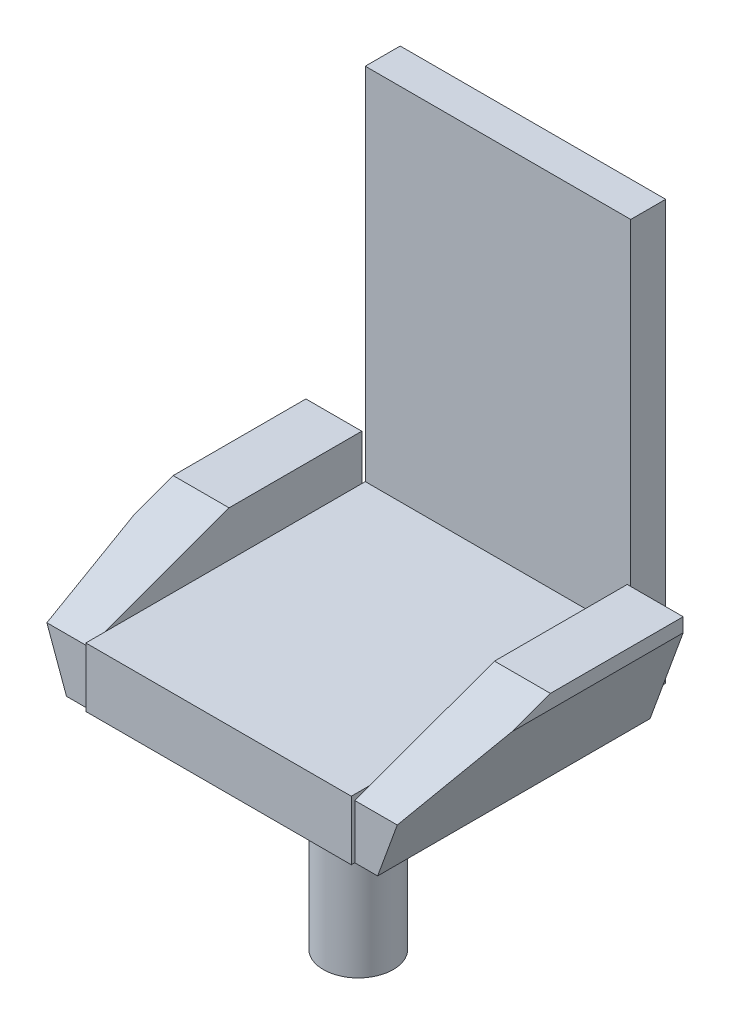
ISO-10303-21;
HEADER;
FILE_DESCRIPTION(('STEP AP214'),'2;1');
FILE_NAME('part.step','',(''),(''),'','','');
FILE_SCHEMA(('AUTOMOTIVE_DESIGN { 1 0 10303 214 1 1 1 1 }'));
ENDSEC;
DATA;
#1=APPLICATION_CONTEXT('core data for automotive mechanical design processes');
#2=APPLICATION_PROTOCOL_DEFINITION('international standard','automotive_design',2000,#1);
#3=PRODUCT_CONTEXT('',#1,'mechanical');
#4=PRODUCT('Part','Part','',(#3));
#5=PRODUCT_RELATED_PRODUCT_CATEGORY('part','',(#4));
#6=PRODUCT_DEFINITION_FORMATION('','',#4);
#7=PRODUCT_DEFINITION_CONTEXT('part definition',#1,'design');
#8=PRODUCT_DEFINITION('design','',#6,#7);
#9=PRODUCT_DEFINITION_SHAPE('','',#8);
#10=(LENGTH_UNIT() NAMED_UNIT(*) SI_UNIT(.MILLI.,.METRE.));
#11=(NAMED_UNIT(*) PLANE_ANGLE_UNIT() SI_UNIT($,.RADIAN.));
#12=(NAMED_UNIT(*) SI_UNIT($,.STERADIAN.) SOLID_ANGLE_UNIT());
#13=UNCERTAINTY_MEASURE_WITH_UNIT(LENGTH_MEASURE(1.E-05),#10,'distance_accuracy_value','');
#14=(GEOMETRIC_REPRESENTATION_CONTEXT(3) GLOBAL_UNCERTAINTY_ASSIGNED_CONTEXT((#13)) GLOBAL_UNIT_ASSIGNED_CONTEXT((#10,
#11,#12)) REPRESENTATION_CONTEXT('',''));
#15=CARTESIAN_POINT('',(0.,0.,0.));
#16=DIRECTION('',(0.,0.,1.));
#17=DIRECTION('',(1.,0.,0.));
#18=AXIS2_PLACEMENT_3D('',#15,#16,#17);
#19=CARTESIAN_POINT('',(190.,85.,200.));
#20=DIRECTION('',(-1.,0.,0.));
#21=DIRECTION('',(0.,0.,1.));
#22=AXIS2_PLACEMENT_3D('',#19,#20,#21);
#23=PLANE('',#22);
#24=DIRECTION('',(0.,-1.,0.));
#25=VECTOR('',#24,1.);
#26=CARTESIAN_POINT('',(190.,150.,195.));
#27=LINE('',#26,#25);
#28=CARTESIAN_POINT('',(190.,77.2059531467595,195.));
#29=VERTEX_POINT('',#28);
#30=CARTESIAN_POINT('',(190.,0.,195.));
#31=VERTEX_POINT('',#30);
#32=EDGE_CURVE('E228',#29,#31,#27,.T.);
#33=ORIENTED_EDGE('',*,*,#32,.F.);
#34=DIRECTION('',(0.,0.342020143325666,-0.93969262078591));
#35=VECTOR('',#34,1.);
#36=CARTESIAN_POINT('',(190.,76.5107144084965,196.910152734508));
#37=LINE('',#36,#35);
#38=CARTESIAN_POINT('',(190.,85.,173.58603226455));
#39=VERTEX_POINT('',#38);
#40=EDGE_CURVE('E300',#29,#39,#37,.T.);
#41=ORIENTED_EDGE('',*,*,#40,.T.);
#42=DIRECTION('',(0.,0.,-1.));
#43=VECTOR('',#42,1.);
#44=CARTESIAN_POINT('',(190.,85.,200.));
#45=LINE('',#44,#43);
#46=CARTESIAN_POINT('',(190.,85.,200.));
#47=VERTEX_POINT('',#46);
#48=EDGE_CURVE('E252',#47,#39,#45,.T.);
#49=ORIENTED_EDGE('',*,*,#48,.F.);
#50=DIRECTION('',(0.,-1.,0.));
#51=VECTOR('',#50,1.);
#52=CARTESIAN_POINT('',(190.,85.,200.));
#53=LINE('',#52,#51);
#54=CARTESIAN_POINT('',(190.,0.,200.));
#55=VERTEX_POINT('',#54);
#56=EDGE_CURVE('E266',#47,#55,#53,.T.);
#57=ORIENTED_EDGE('',*,*,#56,.T.);
#58=DIRECTION('',(0.,0.,-1.));
#59=VECTOR('',#58,1.);
#60=CARTESIAN_POINT('',(190.,0.,200.));
#61=LINE('',#60,#59);
#62=EDGE_CURVE('E267',#55,#31,#61,.T.);
#63=ORIENTED_EDGE('',*,*,#62,.T.);
#64=EDGE_LOOP('',(#33,#41,#49,#57,#63));
#65=FACE_BOUND('',#64,.T.);
#66=ADVANCED_FACE('F37',(#65),#23,.F.);
#67=CARTESIAN_POINT('',(-190.,85.,200.));
#68=DIRECTION('',(1.,0.,0.));
#69=DIRECTION('',(0.,0.,-1.));
#70=AXIS2_PLACEMENT_3D('',#67,#68,#69);
#71=PLANE('',#70);
#72=DIRECTION('',(0.,-1.,0.));
#73=VECTOR('',#72,1.);
#74=CARTESIAN_POINT('',(-190.,150.,-195.));
#75=LINE('',#74,#73);
#76=CARTESIAN_POINT('',(-190.,85.,-195.));
#77=VERTEX_POINT('',#76);
#78=CARTESIAN_POINT('',(-190.,0.,-195.));
#79=VERTEX_POINT('',#78);
#80=EDGE_CURVE('E247',#77,#79,#75,.T.);
#81=ORIENTED_EDGE('',*,*,#80,.F.);
#82=DIRECTION('',(0.,0.,1.));
#83=VECTOR('',#82,1.);
#84=CARTESIAN_POINT('',(-190.,85.,200.));
#85=LINE('',#84,#83);
#86=CARTESIAN_POINT('',(-190.,85.,-200.));
#87=VERTEX_POINT('',#86);
#88=EDGE_CURVE('E260',#87,#77,#85,.T.);
#89=ORIENTED_EDGE('',*,*,#88,.F.);
#90=DIRECTION('',(0.,1.,0.));
#91=VECTOR('',#90,1.);
#92=CARTESIAN_POINT('',(-190.,0.,-200.));
#93=LINE('',#92,#91);
#94=CARTESIAN_POINT('',(-190.,600.,-200.));
#95=VERTEX_POINT('',#94);
#96=EDGE_CURVE('E200',#87,#95,#93,.T.);
#97=ORIENTED_EDGE('',*,*,#96,.T.);
#98=DIRECTION('',(0.,0.,1.));
#99=VECTOR('',#98,1.);
#100=CARTESIAN_POINT('',(-190.,600.,-250.));
#101=LINE('',#100,#99);
#102=CARTESIAN_POINT('',(-190.,600.,-250.));
#103=VERTEX_POINT('',#102);
#104=EDGE_CURVE('E179',#103,#95,#101,.T.);
#105=ORIENTED_EDGE('',*,*,#104,.F.);
#106=DIRECTION('',(0.,1.,0.));
#107=VECTOR('',#106,1.);
#108=CARTESIAN_POINT('',(-190.,0.,-250.));
#109=LINE('',#108,#107);
#110=CARTESIAN_POINT('',(-190.,0.,-250.));
#111=VERTEX_POINT('',#110);
#112=EDGE_CURVE('E186',#111,#103,#109,.T.);
#113=ORIENTED_EDGE('',*,*,#112,.F.);
#114=DIRECTION('',(0.,0.,1.));
#115=VECTOR('',#114,1.);
#116=CARTESIAN_POINT('',(-190.,0.,200.));
#117=LINE('',#116,#115);
#118=EDGE_CURVE('E271',#111,#79,#117,.T.);
#119=ORIENTED_EDGE('',*,*,#118,.T.);
#120=EDGE_LOOP('',(#81,#89,#97,#105,#113,#119));
#121=FACE_BOUND('',#120,.T.);
#122=ADVANCED_FACE('F198',(#121),#71,.F.);
#123=CARTESIAN_POINT('',(190.,85.,-195.));
#124=VERTEX_POINT('',#123);
#125=CARTESIAN_POINT('',(190.,85.,-200.));
#126=VERTEX_POINT('',#125);
#127=EDGE_CURVE('E256',#124,#126,#45,.T.);
#128=ORIENTED_EDGE('',*,*,#127,.F.);
#129=DIRECTION('',(0.,-1.,0.));
#130=VECTOR('',#129,1.);
#131=CARTESIAN_POINT('',(190.,150.,-195.));
#132=LINE('',#131,#130);
#133=CARTESIAN_POINT('',(190.,0.,-195.));
#134=VERTEX_POINT('',#133);
#135=EDGE_CURVE('E224',#124,#134,#132,.T.);
#136=ORIENTED_EDGE('',*,*,#135,.T.);
#137=CARTESIAN_POINT('',(190.,0.,-250.));
#138=VERTEX_POINT('',#137);
#139=EDGE_CURVE('E246',#134,#138,#61,.T.);
#140=ORIENTED_EDGE('',*,*,#139,.T.);
#141=DIRECTION('',(0.,-1.,0.));
#142=VECTOR('',#141,1.);
#143=CARTESIAN_POINT('',(190.,0.,-250.));
#144=LINE('',#143,#142);
#145=CARTESIAN_POINT('',(190.,600.,-250.));
#146=VERTEX_POINT('',#145);
#147=EDGE_CURVE('E185',#146,#138,#144,.T.);
#148=ORIENTED_EDGE('',*,*,#147,.F.);
#149=DIRECTION('',(0.,0.,1.));
#150=VECTOR('',#149,1.);
#151=CARTESIAN_POINT('',(190.,600.,-250.));
#152=LINE('',#151,#150);
#153=CARTESIAN_POINT('',(190.,600.,-200.));
#154=VERTEX_POINT('',#153);
#155=EDGE_CURVE('E181',#146,#154,#152,.T.);
#156=ORIENTED_EDGE('',*,*,#155,.T.);
#157=DIRECTION('',(0.,-1.,0.));
#158=VECTOR('',#157,1.);
#159=CARTESIAN_POINT('',(190.,0.,-200.));
#160=LINE('',#159,#158);
#161=EDGE_CURVE('E195',#154,#126,#160,.T.);
#162=ORIENTED_EDGE('',*,*,#161,.T.);
#163=EDGE_LOOP('',(#128,#136,#140,#148,#156,#162));
#164=FACE_BOUND('',#163,.T.);
#165=ADVANCED_FACE('F366',(#164),#23,.F.);
#166=CARTESIAN_POINT('',(-190.,85.,173.58603226455));
#167=VERTEX_POINT('',#166);
#168=CARTESIAN_POINT('',(-190.,85.,200.));
#169=VERTEX_POINT('',#168);
#170=EDGE_CURVE('E259',#167,#169,#85,.T.);
#171=ORIENTED_EDGE('',*,*,#170,.F.);
#172=DIRECTION('',(0.,-0.342020143325666,0.93969262078591));
#173=VECTOR('',#172,1.);
#174=CARTESIAN_POINT('',(-190.,76.5107144084965,196.910152734508));
#175=LINE('',#174,#173);
#176=CARTESIAN_POINT('',(-190.,77.2059531467595,195.));
#177=VERTEX_POINT('',#176);
#178=EDGE_CURVE('E298',#167,#177,#175,.T.);
#179=ORIENTED_EDGE('',*,*,#178,.T.);
#180=DIRECTION('',(0.,-1.,0.));
#181=VECTOR('',#180,1.);
#182=CARTESIAN_POINT('',(-190.,150.,195.));
#183=LINE('',#182,#181);
#184=CARTESIAN_POINT('',(-190.,0.,195.));
#185=VERTEX_POINT('',#184);
#186=EDGE_CURVE('E248',#177,#185,#183,.T.);
#187=ORIENTED_EDGE('',*,*,#186,.T.);
#188=CARTESIAN_POINT('',(-190.,0.,200.));
#189=VERTEX_POINT('',#188);
#190=EDGE_CURVE('E270',#185,#189,#117,.T.);
#191=ORIENTED_EDGE('',*,*,#190,.T.);
#192=DIRECTION('',(0.,-1.,0.));
#193=VECTOR('',#192,1.);
#194=CARTESIAN_POINT('',(-190.,85.,200.));
#195=LINE('',#194,#193);
#196=EDGE_CURVE('E251',#169,#189,#195,.T.);
#197=ORIENTED_EDGE('',*,*,#196,.F.);
#198=EDGE_LOOP('',(#171,#179,#187,#191,#197));
#199=FACE_BOUND('',#198,.T.);
#200=ADVANCED_FACE('F341',(#199),#71,.F.);
#201=CARTESIAN_POINT('',(-190.,85.,200.));
#202=DIRECTION('',(0.,0.,-1.));
#203=DIRECTION('',(-1.,0.,0.));
#204=AXIS2_PLACEMENT_3D('',#201,#202,#203);
#205=PLANE('',#204);
#206=DIRECTION('',(1.,0.,0.));
#207=VECTOR('',#206,1.);
#208=CARTESIAN_POINT('',(-190.,0.,200.));
#209=LINE('',#208,#207);
#210=EDGE_CURVE('E273',#189,#55,#209,.T.);
#211=ORIENTED_EDGE('',*,*,#210,.T.);
#212=ORIENTED_EDGE('',*,*,#56,.F.);
#213=DIRECTION('',(1.,0.,0.));
#214=VECTOR('',#213,1.);
#215=CARTESIAN_POINT('',(-190.,85.,200.));
#216=LINE('',#215,#214);
#217=EDGE_CURVE('E263',#169,#47,#216,.T.);
#218=ORIENTED_EDGE('',*,*,#217,.F.);
#219=ORIENTED_EDGE('',*,*,#196,.T.);
#220=EDGE_LOOP('',(#211,#212,#218,#219));
#221=FACE_BOUND('',#220,.T.);
#222=ADVANCED_FACE('F344',(#221),#205,.F.);
#223=CARTESIAN_POINT('',(0.,85.,0.));
#224=DIRECTION('',(0.,-1.,0.));
#225=DIRECTION('',(0.,0.,-1.));
#226=AXIS2_PLACEMENT_3D('',#223,#224,#225);
#227=PLANE('',#226);
#228=ORIENTED_EDGE('',*,*,#48,.T.);
#229=EDGE_CURVE('E255',#39,#124,#45,.T.);
#230=ORIENTED_EDGE('',*,*,#229,.T.);
#231=ORIENTED_EDGE('',*,*,#127,.T.);
#232=DIRECTION('',(-1.,0.,0.));
#233=VECTOR('',#232,1.);
#234=CARTESIAN_POINT('',(-190.,85.,-200.));
#235=LINE('',#234,#233);
#236=EDGE_CURVE('E254',#126,#87,#235,.T.);
#237=ORIENTED_EDGE('',*,*,#236,.T.);
#238=ORIENTED_EDGE('',*,*,#88,.T.);
#239=EDGE_CURVE('E264',#77,#167,#85,.T.);
#240=ORIENTED_EDGE('',*,*,#239,.T.);
#241=ORIENTED_EDGE('',*,*,#170,.T.);
#242=ORIENTED_EDGE('',*,*,#217,.T.);
#243=EDGE_LOOP('',(#228,#230,#231,#237,#238,#240,#241,#242));
#244=FACE_BOUND('',#243,.T.);
#245=ADVANCED_FACE('F348',(#244),#227,.F.);
#246=CARTESIAN_POINT('',(0.,0.,0.));
#247=DIRECTION('',(0.,-1.,0.));
#248=DIRECTION('',(0.,0.,-1.));
#249=AXIS2_PLACEMENT_3D('',#246,#247,#248);
#250=PLANE('',#249);
#251=CARTESIAN_POINT('',(0.,0.,0.));
#252=DIRECTION('',(0.,-1.,0.));
#253=DIRECTION('',(0.,0.,-1.));
#254=AXIS2_PLACEMENT_3D('',#251,#252,#253);
#255=CIRCLE('',#254,50.);
#256=CARTESIAN_POINT('',(0.,0.,-50.));
#257=VERTEX_POINT('',#256);
#258=EDGE_CURVE('E375',#257,#257,#255,.T.);
#259=ORIENTED_EDGE('',*,*,#258,.F.);
#260=EDGE_LOOP('',(#259));
#261=FACE_BOUND('',#260,.T.);
#262=DIRECTION('',(1.,0.,0.));
#263=VECTOR('',#262,1.);
#264=CARTESIAN_POINT('',(0.,0.,-195.));
#265=LINE('',#264,#263);
#266=CARTESIAN_POINT('',(222.683869545394,0.,-195.));
#267=VERTEX_POINT('',#266);
#268=EDGE_CURVE('E205',#134,#267,#265,.T.);
#269=ORIENTED_EDGE('',*,*,#268,.T.);
#270=DIRECTION('',(0.,0.,1.));
#271=VECTOR('',#270,1.);
#272=CARTESIAN_POINT('',(222.683869545394,0.,195.));
#273=LINE('',#272,#271);
#274=CARTESIAN_POINT('',(222.683869545394,0.,195.));
#275=VERTEX_POINT('',#274);
#276=EDGE_CURVE('E311',#267,#275,#273,.T.);
#277=ORIENTED_EDGE('',*,*,#276,.T.);
#278=DIRECTION('',(1.,0.,0.));
#279=VECTOR('',#278,1.);
#280=CARTESIAN_POINT('',(0.,0.,195.));
#281=LINE('',#280,#279);
#282=EDGE_CURVE('E202',#31,#275,#281,.T.);
#283=ORIENTED_EDGE('',*,*,#282,.F.);
#284=ORIENTED_EDGE('',*,*,#62,.F.);
#285=ORIENTED_EDGE('',*,*,#210,.F.);
#286=ORIENTED_EDGE('',*,*,#190,.F.);
#287=DIRECTION('',(1.,0.,0.));
#288=VECTOR('',#287,1.);
#289=CARTESIAN_POINT('',(0.,0.,195.));
#290=LINE('',#289,#288);
#291=CARTESIAN_POINT('',(-222.683869545394,0.,195.));
#292=VERTEX_POINT('',#291);
#293=EDGE_CURVE('E227',#292,#185,#290,.T.);
#294=ORIENTED_EDGE('',*,*,#293,.F.);
#295=DIRECTION('',(0.,0.,-1.));
#296=VECTOR('',#295,1.);
#297=CARTESIAN_POINT('',(-222.683869545394,0.,0.));
#298=LINE('',#297,#296);
#299=CARTESIAN_POINT('',(-222.683869545394,0.,-195.));
#300=VERTEX_POINT('',#299);
#301=EDGE_CURVE('E308',#292,#300,#298,.T.);
#302=ORIENTED_EDGE('',*,*,#301,.T.);
#303=DIRECTION('',(1.,0.,0.));
#304=VECTOR('',#303,1.);
#305=CARTESIAN_POINT('',(0.,0.,-195.));
#306=LINE('',#305,#304);
#307=EDGE_CURVE('E234',#300,#79,#306,.T.);
#308=ORIENTED_EDGE('',*,*,#307,.T.);
#309=ORIENTED_EDGE('',*,*,#118,.F.);
#310=DIRECTION('',(-1.,0.,0.));
#311=VECTOR('',#310,1.);
#312=CARTESIAN_POINT('',(-190.,0.,-250.));
#313=LINE('',#312,#311);
#314=EDGE_CURVE('E192',#138,#111,#313,.T.);
#315=ORIENTED_EDGE('',*,*,#314,.F.);
#316=ORIENTED_EDGE('',*,*,#139,.F.);
#317=EDGE_LOOP('',(#269,#277,#283,#284,#285,#286,#294,#302,#308,#309,#315,#316));
#318=FACE_BOUND('',#317,.T.);
#319=ADVANCED_FACE('F336',(#261,#318),#250,.T.);
#320=CARTESIAN_POINT('',(0.,150.,195.));
#321=DIRECTION('',(0.,0.,-1.));
#322=DIRECTION('',(-1.,0.,0.));
#323=AXIS2_PLACEMENT_3D('',#320,#321,#322);
#324=PLANE('',#323);
#325=DIRECTION('',(-1.,0.,0.));
#326=VECTOR('',#325,1.);
#327=CARTESIAN_POINT('',(-270.,77.2059531467595,195.));
#328=LINE('',#327,#326);
#329=CARTESIAN_POINT('',(-250.784538398965,77.2059531467595,195.));
#330=VERTEX_POINT('',#329);
#331=EDGE_CURVE('E284',#177,#330,#328,.T.);
#332=ORIENTED_EDGE('',*,*,#331,.T.);
#333=DIRECTION('',(-0.342020143325666,0.939692620785909,0.));
#334=VECTOR('',#333,1.);
#335=CARTESIAN_POINT('',(-222.683869545394,0.,195.));
#336=LINE('',#335,#334);
#337=EDGE_CURVE('E11',#330,#292,#336,.F.);
#338=ORIENTED_EDGE('',*,*,#337,.T.);
#339=ORIENTED_EDGE('',*,*,#293,.T.);
#340=ORIENTED_EDGE('',*,*,#186,.F.);
#341=EDGE_LOOP('',(#332,#338,#339,#340));
#342=FACE_BOUND('',#341,.T.);
#343=ADVANCED_FACE('F332',(#342),#324,.F.);
#344=CARTESIAN_POINT('',(-190.,150.,0.));
#345=DIRECTION('',(-1.,0.,0.));
#346=DIRECTION('',(0.,0.,1.));
#347=AXIS2_PLACEMENT_3D('',#344,#345,#346);
#348=PLANE('',#347);
#349=DIRECTION('',(0.,0.,-1.));
#350=VECTOR('',#349,1.);
#351=CARTESIAN_POINT('',(-190.,150.,0.));
#352=LINE('',#351,#350);
#353=CARTESIAN_POINT('',(-190.,150.,-5.00000000000195));
#354=VERTEX_POINT('',#353);
#355=CARTESIAN_POINT('',(-190.,150.,-195.));
#356=VERTEX_POINT('',#355);
#357=EDGE_CURVE('E231',#354,#356,#352,.T.);
#358=ORIENTED_EDGE('',*,*,#357,.F.);
#359=DIRECTION('',(0.,-0.342020143325666,0.93969262078591));
#360=VECTOR('',#359,1.);
#361=CARTESIAN_POINT('',(-190.,150.,-5.00000000000195));
#362=LINE('',#361,#360);
#363=EDGE_CURVE('E281',#354,#167,#362,.T.);
#364=ORIENTED_EDGE('',*,*,#363,.T.);
#365=ORIENTED_EDGE('',*,*,#239,.F.);
#366=EDGE_CURVE('E243',#356,#77,#75,.T.);
#367=ORIENTED_EDGE('',*,*,#366,.F.);
#368=EDGE_LOOP('',(#358,#364,#365,#367));
#369=FACE_BOUND('',#368,.T.);
#370=ADVANCED_FACE('F353',(#369),#348,.F.);
#371=CARTESIAN_POINT('',(0.,150.,-195.));
#372=DIRECTION('',(0.,0.,-1.));
#373=DIRECTION('',(-1.,0.,0.));
#374=AXIS2_PLACEMENT_3D('',#371,#372,#373);
#375=PLANE('',#374);
#376=ORIENTED_EDGE('',*,*,#307,.F.);
#377=DIRECTION('',(0.342020143325666,-0.939692620785909,0.));
#378=VECTOR('',#377,1.);
#379=CARTESIAN_POINT('',(-244.843875917927,60.8841171235077,-195.));
#380=LINE('',#379,#378);
#381=CARTESIAN_POINT('',(-270.,130.000000000001,-195.));
#382=VERTEX_POINT('',#381);
#383=EDGE_CURVE('E317',#300,#382,#380,.F.);
#384=ORIENTED_EDGE('',*,*,#383,.T.);
#385=DIRECTION('',(0.,-1.,0.));
#386=VECTOR('',#385,1.);
#387=CARTESIAN_POINT('',(-270.,150.,-195.));
#388=LINE('',#387,#386);
#389=CARTESIAN_POINT('',(-270.,150.,-195.));
#390=VERTEX_POINT('',#389);
#391=EDGE_CURVE('E239',#390,#382,#388,.T.);
#392=ORIENTED_EDGE('',*,*,#391,.F.);
#393=DIRECTION('',(1.,0.,0.));
#394=VECTOR('',#393,1.);
#395=CARTESIAN_POINT('',(0.,150.,-195.));
#396=LINE('',#395,#394);
#397=EDGE_CURVE('E233',#390,#356,#396,.T.);
#398=ORIENTED_EDGE('',*,*,#397,.T.);
#399=ORIENTED_EDGE('',*,*,#366,.T.);
#400=ORIENTED_EDGE('',*,*,#80,.T.);
#401=EDGE_LOOP('',(#376,#384,#392,#398,#399,#400));
#402=FACE_BOUND('',#401,.T.);
#403=ADVANCED_FACE('F322',(#402),#375,.T.);
#404=CARTESIAN_POINT('',(-270.,150.,0.));
#405=DIRECTION('',(-1.,0.,0.));
#406=DIRECTION('',(0.,0.,1.));
#407=AXIS2_PLACEMENT_3D('',#404,#405,#406);
#408=PLANE('',#407);
#409=ORIENTED_EDGE('',*,*,#391,.T.);
#410=DIRECTION('',(0.,0.,1.));
#411=VECTOR('',#410,1.);
#412=CARTESIAN_POINT('',(-270.,130.000000000001,0.));
#413=LINE('',#412,#411);
#414=CARTESIAN_POINT('',(-270.,130.000000000001,49.9495483890879));
#415=VERTEX_POINT('',#414);
#416=EDGE_CURVE('E60',#382,#415,#413,.T.);
#417=ORIENTED_EDGE('',*,*,#416,.T.);
#418=DIRECTION('',(0.,0.342020143325666,-0.93969262078591));
#419=VECTOR('',#418,1.);
#420=CARTESIAN_POINT('',(-270.,148.393030975783,-0.584888892202773));
#421=LINE('',#420,#419);
#422=CARTESIAN_POINT('',(-270.,150.,-5.00000000000195));
#423=VERTEX_POINT('',#422);
#424=EDGE_CURVE('E286',#415,#423,#421,.T.);
#425=ORIENTED_EDGE('',*,*,#424,.T.);
#426=DIRECTION('',(0.,0.,-1.));
#427=VECTOR('',#426,1.);
#428=CARTESIAN_POINT('',(-270.,150.,0.));
#429=LINE('',#428,#427);
#430=EDGE_CURVE('E237',#423,#390,#429,.T.);
#431=ORIENTED_EDGE('',*,*,#430,.T.);
#432=EDGE_LOOP('',(#409,#417,#425,#431));
#433=FACE_BOUND('',#432,.T.);
#434=ADVANCED_FACE('F327',(#433),#408,.T.);
#435=CARTESIAN_POINT('',(0.,150.,0.));
#436=DIRECTION('',(0.,1.,0.));
#437=DIRECTION('',(0.,0.,1.));
#438=AXIS2_PLACEMENT_3D('',#435,#436,#437);
#439=PLANE('',#438);
#440=ORIENTED_EDGE('',*,*,#430,.F.);
#441=DIRECTION('',(1.,0.,0.));
#442=VECTOR('',#441,1.);
#443=CARTESIAN_POINT('',(-190.,150.,-5.00000000000195));
#444=LINE('',#443,#442);
#445=EDGE_CURVE('E230',#423,#354,#444,.T.);
#446=ORIENTED_EDGE('',*,*,#445,.T.);
#447=ORIENTED_EDGE('',*,*,#357,.T.);
#448=ORIENTED_EDGE('',*,*,#397,.F.);
#449=EDGE_LOOP('',(#440,#446,#447,#448));
#450=FACE_BOUND('',#449,.T.);
#451=ADVANCED_FACE('F358',(#450),#439,.T.);
#452=CARTESIAN_POINT('',(190.,150.,0.));
#453=DIRECTION('',(1.,0.,0.));
#454=DIRECTION('',(0.,0.,-1.));
#455=AXIS2_PLACEMENT_3D('',#452,#453,#454);
#456=PLANE('',#455);
#457=ORIENTED_EDGE('',*,*,#229,.F.);
#458=DIRECTION('',(0.,0.342020143325666,-0.93969262078591));
#459=VECTOR('',#458,1.);
#460=CARTESIAN_POINT('',(190.,150.,-5.00000000000195));
#461=LINE('',#460,#459);
#462=CARTESIAN_POINT('',(190.,150.,-5.00000000000195));
#463=VERTEX_POINT('',#462);
#464=EDGE_CURVE('E296',#39,#463,#461,.T.);
#465=ORIENTED_EDGE('',*,*,#464,.T.);
#466=DIRECTION('',(0.,0.,1.));
#467=VECTOR('',#466,1.);
#468=CARTESIAN_POINT('',(190.,150.,0.));
#469=LINE('',#468,#467);
#470=CARTESIAN_POINT('',(190.,150.,-195.));
#471=VERTEX_POINT('',#470);
#472=EDGE_CURVE('E210',#471,#463,#469,.T.);
#473=ORIENTED_EDGE('',*,*,#472,.F.);
#474=EDGE_CURVE('E217',#471,#124,#132,.T.);
#475=ORIENTED_EDGE('',*,*,#474,.T.);
#476=EDGE_LOOP('',(#457,#465,#473,#475));
#477=FACE_BOUND('',#476,.T.);
#478=ADVANCED_FACE('F465',(#477),#456,.F.);
#479=CARTESIAN_POINT('',(0.,150.,195.));
#480=DIRECTION('',(0.,0.,-1.));
#481=DIRECTION('',(-1.,0.,0.));
#482=AXIS2_PLACEMENT_3D('',#479,#480,#481);
#483=PLANE('',#482);
#484=ORIENTED_EDGE('',*,*,#282,.T.);
#485=DIRECTION('',(0.342020143325666,0.939692620785909,0.));
#486=VECTOR('',#485,1.);
#487=CARTESIAN_POINT('',(270.,130.000000000001,195.));
#488=LINE('',#487,#486);
#489=CARTESIAN_POINT('',(250.784538398965,77.2059531467595,195.));
#490=VERTEX_POINT('',#489);
#491=EDGE_CURVE('E313',#275,#490,#488,.T.);
#492=ORIENTED_EDGE('',*,*,#491,.T.);
#493=DIRECTION('',(-1.,0.,0.));
#494=VECTOR('',#493,1.);
#495=CARTESIAN_POINT('',(190.,77.2059531467595,195.));
#496=LINE('',#495,#494);
#497=EDGE_CURVE('E294',#490,#29,#496,.T.);
#498=ORIENTED_EDGE('',*,*,#497,.T.);
#499=ORIENTED_EDGE('',*,*,#32,.T.);
#500=EDGE_LOOP('',(#484,#492,#498,#499));
#501=FACE_BOUND('',#500,.T.);
#502=ADVANCED_FACE('F471',(#501),#483,.F.);
#503=CARTESIAN_POINT('',(270.,150.,0.));
#504=DIRECTION('',(-1.,0.,0.));
#505=DIRECTION('',(0.,0.,1.));
#506=AXIS2_PLACEMENT_3D('',#503,#504,#505);
#507=PLANE('',#506);
#508=DIRECTION('',(0.,-0.342020143325666,0.93969262078591));
#509=VECTOR('',#508,1.);
#510=CARTESIAN_POINT('',(270.,150.,-5.00000000000195));
#511=LINE('',#510,#509);
#512=CARTESIAN_POINT('',(270.,150.,-5.00000000000195));
#513=VERTEX_POINT('',#512);
#514=CARTESIAN_POINT('',(270.,130.000000000001,49.9495483890879));
#515=VERTEX_POINT('',#514);
#516=EDGE_CURVE('E291',#513,#515,#511,.T.);
#517=ORIENTED_EDGE('',*,*,#516,.T.);
#518=DIRECTION('',(0.,0.,-1.));
#519=VECTOR('',#518,1.);
#520=CARTESIAN_POINT('',(270.,130.000000000001,-195.));
#521=LINE('',#520,#519);
#522=CARTESIAN_POINT('',(270.,130.000000000001,-195.));
#523=VERTEX_POINT('',#522);
#524=EDGE_CURVE('E303',#515,#523,#521,.T.);
#525=ORIENTED_EDGE('',*,*,#524,.T.);
#526=DIRECTION('',(0.,-1.,0.));
#527=VECTOR('',#526,1.);
#528=CARTESIAN_POINT('',(270.,150.,-195.));
#529=LINE('',#528,#527);
#530=CARTESIAN_POINT('',(270.,150.,-195.));
#531=VERTEX_POINT('',#530);
#532=EDGE_CURVE('E223',#531,#523,#529,.T.);
#533=ORIENTED_EDGE('',*,*,#532,.F.);
#534=DIRECTION('',(0.,0.,-1.));
#535=VECTOR('',#534,1.);
#536=CARTESIAN_POINT('',(270.,150.,0.));
#537=LINE('',#536,#535);
#538=EDGE_CURVE('E213',#513,#531,#537,.T.);
#539=ORIENTED_EDGE('',*,*,#538,.F.);
#540=EDGE_LOOP('',(#517,#525,#533,#539));
#541=FACE_BOUND('',#540,.T.);
#542=ADVANCED_FACE('F479',(#541),#507,.F.);
#543=CARTESIAN_POINT('',(0.,150.,-195.));
#544=DIRECTION('',(0.,0.,-1.));
#545=DIRECTION('',(-1.,0.,0.));
#546=AXIS2_PLACEMENT_3D('',#543,#544,#545);
#547=PLANE('',#546);
#548=ORIENTED_EDGE('',*,*,#532,.T.);
#549=DIRECTION('',(-0.342020143325666,-0.939692620785909,0.));
#550=VECTOR('',#549,1.);
#551=CARTESIAN_POINT('',(244.843875917928,60.8841171235077,-195.));
#552=LINE('',#551,#550);
#553=EDGE_CURVE('E306',#523,#267,#552,.T.);
#554=ORIENTED_EDGE('',*,*,#553,.T.);
#555=ORIENTED_EDGE('',*,*,#268,.F.);
#556=ORIENTED_EDGE('',*,*,#135,.F.);
#557=ORIENTED_EDGE('',*,*,#474,.F.);
#558=DIRECTION('',(1.,0.,0.));
#559=VECTOR('',#558,1.);
#560=CARTESIAN_POINT('',(0.,150.,-195.));
#561=LINE('',#560,#559);
#562=EDGE_CURVE('E215',#471,#531,#561,.T.);
#563=ORIENTED_EDGE('',*,*,#562,.T.);
#564=EDGE_LOOP('',(#548,#554,#555,#556,#557,#563));
#565=FACE_BOUND('',#564,.T.);
#566=ADVANCED_FACE('F491',(#565),#547,.T.);
#567=CARTESIAN_POINT('',(0.,150.,0.));
#568=DIRECTION('',(0.,1.,0.));
#569=DIRECTION('',(0.,0.,1.));
#570=AXIS2_PLACEMENT_3D('',#567,#568,#569);
#571=PLANE('',#570);
#572=ORIENTED_EDGE('',*,*,#472,.T.);
#573=DIRECTION('',(1.,0.,0.));
#574=VECTOR('',#573,1.);
#575=CARTESIAN_POINT('',(270.,150.,-5.00000000000195));
#576=LINE('',#575,#574);
#577=EDGE_CURVE('E288',#463,#513,#576,.T.);
#578=ORIENTED_EDGE('',*,*,#577,.T.);
#579=ORIENTED_EDGE('',*,*,#538,.T.);
#580=ORIENTED_EDGE('',*,*,#562,.F.);
#581=EDGE_LOOP('',(#572,#578,#579,#580));
#582=FACE_BOUND('',#581,.T.);
#583=ADVANCED_FACE('F502',(#582),#571,.T.);
#584=CARTESIAN_POINT('',(0.,150.,-5.00000000000195));
#585=DIRECTION('',(0.,0.93969262078591,0.342020143325666));
#586=DIRECTION('',(-1.,0.,0.));
#587=AXIS2_PLACEMENT_3D('',#584,#585,#586);
#588=PLANE('',#587);
#589=ORIENTED_EDGE('',*,*,#424,.F.);
#590=DIRECTION('',(-0.123531673829373,0.339400484433638,-0.932495167133388));
#591=VECTOR('',#590,1.);
#592=CARTESIAN_POINT('',(-273.0481003294,138.37458682726,26.9405601839325));
#593=LINE('',#592,#591);
#594=EDGE_CURVE('E46',#415,#330,#593,.F.);
#595=ORIENTED_EDGE('',*,*,#594,.T.);
#596=ORIENTED_EDGE('',*,*,#331,.F.);
#597=ORIENTED_EDGE('',*,*,#178,.F.);
#598=ORIENTED_EDGE('',*,*,#363,.F.);
#599=ORIENTED_EDGE('',*,*,#445,.F.);
#600=EDGE_LOOP('',(#589,#595,#596,#597,#598,#599));
#601=FACE_BOUND('',#600,.T.);
#602=ADVANCED_FACE('F356',(#601),#588,.T.);
#603=CARTESIAN_POINT('',(0.,150.,-5.00000000000195));
#604=DIRECTION('',(0.,0.93969262078591,0.342020143325666));
#605=DIRECTION('',(-1.,0.,0.));
#606=AXIS2_PLACEMENT_3D('',#603,#604,#605);
#607=PLANE('',#606);
#608=ORIENTED_EDGE('',*,*,#497,.F.);
#609=DIRECTION('',(0.123531673829373,0.339400484433638,-0.932495167133388));
#610=VECTOR('',#609,1.);
#611=CARTESIAN_POINT('',(273.0481003294,138.37458682726,26.9405601839325));
#612=LINE('',#611,#610);
#613=EDGE_CURVE('E315',#490,#515,#612,.T.);
#614=ORIENTED_EDGE('',*,*,#613,.T.);
#615=ORIENTED_EDGE('',*,*,#516,.F.);
#616=ORIENTED_EDGE('',*,*,#577,.F.);
#617=ORIENTED_EDGE('',*,*,#464,.F.);
#618=ORIENTED_EDGE('',*,*,#40,.F.);
#619=EDGE_LOOP('',(#608,#614,#615,#616,#617,#618));
#620=FACE_BOUND('',#619,.T.);
#621=ADVANCED_FACE('F518',(#620),#607,.T.);
#622=CARTESIAN_POINT('',(270.,130.000000000001,0.));
#623=DIRECTION('',(0.939692620785909,-0.342020143325666,0.));
#624=DIRECTION('',(0.,0.,1.));
#625=AXIS2_PLACEMENT_3D('',#622,#623,#624);
#626=PLANE('',#625);
#627=ORIENTED_EDGE('',*,*,#491,.F.);
#628=ORIENTED_EDGE('',*,*,#276,.F.);
#629=ORIENTED_EDGE('',*,*,#553,.F.);
#630=ORIENTED_EDGE('',*,*,#524,.F.);
#631=ORIENTED_EDGE('',*,*,#613,.F.);
#632=EDGE_LOOP('',(#627,#628,#629,#630,#631));
#633=FACE_BOUND('',#632,.T.);
#634=ADVANCED_FACE('F526',(#633),#626,.T.);
#635=CARTESIAN_POINT('',(-222.683869545394,0.,0.));
#636=DIRECTION('',(0.939692620785909,0.342020143325666,0.));
#637=DIRECTION('',(0.,0.,-1.));
#638=AXIS2_PLACEMENT_3D('',#635,#636,#637);
#639=PLANE('',#638);
#640=ORIENTED_EDGE('',*,*,#594,.F.);
#641=ORIENTED_EDGE('',*,*,#416,.F.);
#642=ORIENTED_EDGE('',*,*,#383,.F.);
#643=ORIENTED_EDGE('',*,*,#301,.F.);
#644=ORIENTED_EDGE('',*,*,#337,.F.);
#645=EDGE_LOOP('',(#640,#641,#642,#643,#644));
#646=FACE_BOUND('',#645,.T.);
#647=ADVANCED_FACE('F40',(#646),#639,.F.);
#648=CARTESIAN_POINT('',(-190.,600.,-250.));
#649=DIRECTION('',(0.,-1.,0.));
#650=DIRECTION('',(0.,0.,-1.));
#651=AXIS2_PLACEMENT_3D('',#648,#649,#650);
#652=PLANE('',#651);
#653=DIRECTION('',(1.,0.,0.));
#654=VECTOR('',#653,1.);
#655=CARTESIAN_POINT('',(-190.,600.,-200.));
#656=LINE('',#655,#654);
#657=EDGE_CURVE('E368',#95,#154,#656,.T.);
#658=ORIENTED_EDGE('',*,*,#657,.T.);
#659=ORIENTED_EDGE('',*,*,#155,.F.);
#660=DIRECTION('',(1.,0.,0.));
#661=VECTOR('',#660,1.);
#662=CARTESIAN_POINT('',(-190.,600.,-250.));
#663=LINE('',#662,#661);
#664=EDGE_CURVE('E175',#103,#146,#663,.T.);
#665=ORIENTED_EDGE('',*,*,#664,.F.);
#666=ORIENTED_EDGE('',*,*,#104,.T.);
#667=EDGE_LOOP('',(#658,#659,#665,#666));
#668=FACE_BOUND('',#667,.T.);
#669=ADVANCED_FACE('F177',(#668),#652,.F.);
#670=CARTESIAN_POINT('',(0.,0.,-250.));
#671=DIRECTION('',(0.,0.,-1.));
#672=DIRECTION('',(-1.,0.,0.));
#673=AXIS2_PLACEMENT_3D('',#670,#671,#672);
#674=PLANE('',#673);
#675=ORIENTED_EDGE('',*,*,#112,.T.);
#676=ORIENTED_EDGE('',*,*,#664,.T.);
#677=ORIENTED_EDGE('',*,*,#147,.T.);
#678=ORIENTED_EDGE('',*,*,#314,.T.);
#679=EDGE_LOOP('',(#675,#676,#677,#678));
#680=FACE_BOUND('',#679,.T.);
#681=ADVANCED_FACE('F190',(#680),#674,.T.);
#682=CARTESIAN_POINT('',(0.,0.,-200.));
#683=DIRECTION('',(0.,0.,-1.));
#684=DIRECTION('',(-1.,0.,0.));
#685=AXIS2_PLACEMENT_3D('',#682,#683,#684);
#686=PLANE('',#685);
#687=ORIENTED_EDGE('',*,*,#236,.F.);
#688=ORIENTED_EDGE('',*,*,#161,.F.);
#689=ORIENTED_EDGE('',*,*,#657,.F.);
#690=ORIENTED_EDGE('',*,*,#96,.F.);
#691=EDGE_LOOP('',(#687,#688,#689,#690));
#692=FACE_BOUND('',#691,.T.);
#693=ADVANCED_FACE('F364',(#692),#686,.F.);
#694=CARTESIAN_POINT('',(0.,-300.,0.));
#695=DIRECTION('',(0.,1.,0.));
#696=DIRECTION('',(0.,0.,1.));
#697=AXIS2_PLACEMENT_3D('',#694,#695,#696);
#698=CYLINDRICAL_SURFACE('',#697,50.);
#699=CARTESIAN_POINT('',(0.,-300.,0.));
#700=DIRECTION('',(0.,-1.,0.));
#701=DIRECTION('',(0.,0.,-1.));
#702=AXIS2_PLACEMENT_3D('',#699,#700,#701);
#703=CIRCLE('',#702,50.);
#704=CARTESIAN_POINT('',(0.,-300.,-50.));
#705=VERTEX_POINT('',#704);
#706=EDGE_CURVE('E372',#705,#705,#703,.T.);
#707=ORIENTED_EDGE('',*,*,#706,.F.);
#708=EDGE_LOOP('',(#707));
#709=FACE_BOUND('',#708,.T.);
#710=ORIENTED_EDGE('',*,*,#258,.T.);
#711=EDGE_LOOP('',(#710));
#712=FACE_BOUND('',#711,.T.);
#713=ADVANCED_FACE('F383',(#709,#712),#698,.T.);
#714=CARTESIAN_POINT('',(0.,-300.,0.));
#715=DIRECTION('',(0.,-1.,0.));
#716=DIRECTION('',(0.,0.,-1.));
#717=AXIS2_PLACEMENT_3D('',#714,#715,#716);
#718=PLANE('',#717);
#719=ORIENTED_EDGE('',*,*,#706,.T.);
#720=EDGE_LOOP('',(#719));
#721=FACE_BOUND('',#720,.T.);
#722=ADVANCED_FACE('F381',(#721),#718,.T.);
#723=CLOSED_SHELL('',(#66,#122,#165,#200,#222,#245,#319,#343,#370,#403,#434,#451,#478,#502,#542,
#566,#583,#602,#621,#634,#647,#669,#681,#693,#713,#722));
#724=MANIFOLD_SOLID_BREP('B2',#723);
#725=ADVANCED_BREP_SHAPE_REPRESENTATION('',(#18,#724),#14);
#726=SHAPE_DEFINITION_REPRESENTATION(#9,#725);
ENDSEC;
END-ISO-10303-21;
